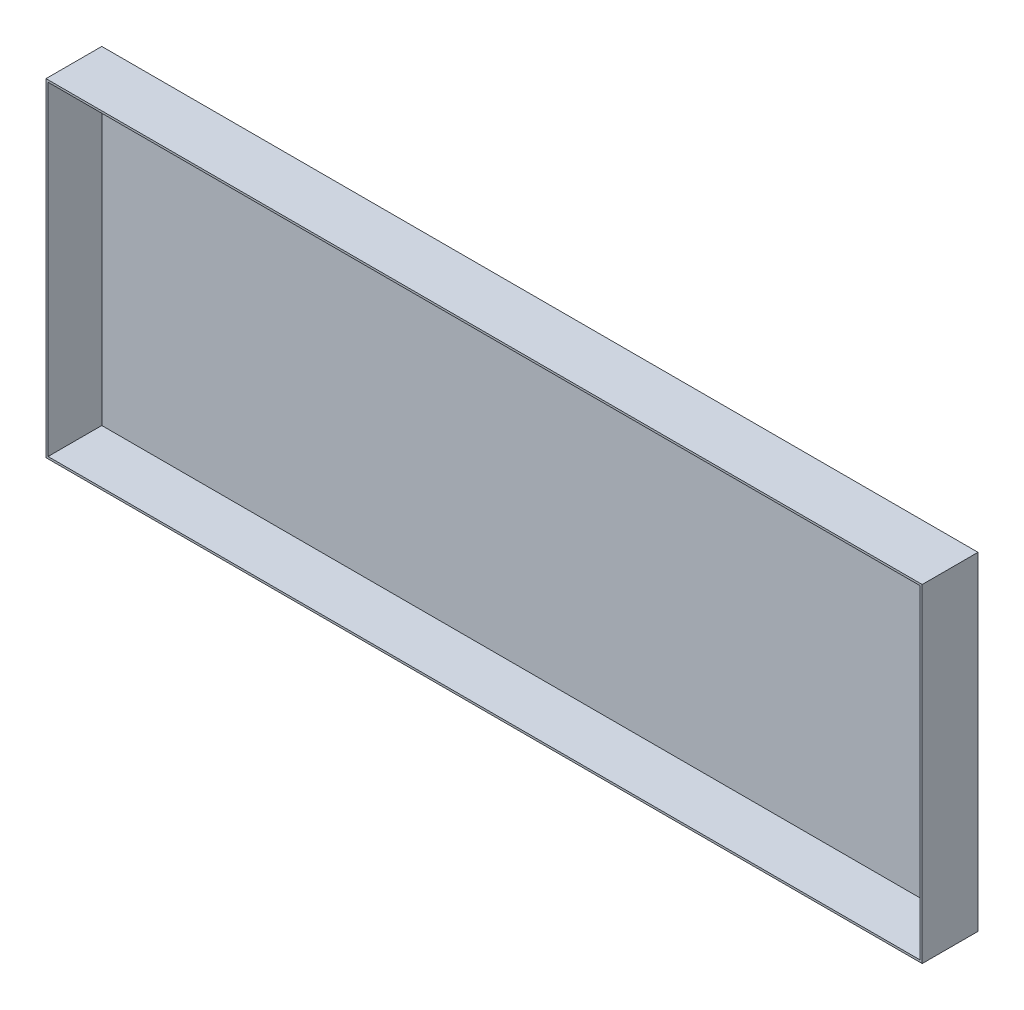
ISO-10303-21;
HEADER;
FILE_DESCRIPTION(('STEP AP214'),'2;1');
FILE_NAME('part.step','',(''),(''),'','','');
FILE_SCHEMA(('AUTOMOTIVE_DESIGN { 1 0 10303 214 1 1 1 1 }'));
ENDSEC;
DATA;
#1=APPLICATION_CONTEXT('core data for automotive mechanical design processes');
#2=APPLICATION_PROTOCOL_DEFINITION('international standard','automotive_design',2000,#1);
#3=PRODUCT_CONTEXT('',#1,'mechanical');
#4=PRODUCT('Part','Part','',(#3));
#5=PRODUCT_RELATED_PRODUCT_CATEGORY('part','',(#4));
#6=PRODUCT_DEFINITION_FORMATION('','',#4);
#7=PRODUCT_DEFINITION_CONTEXT('part definition',#1,'design');
#8=PRODUCT_DEFINITION('design','',#6,#7);
#9=PRODUCT_DEFINITION_SHAPE('','',#8);
#10=(LENGTH_UNIT() NAMED_UNIT(*) SI_UNIT(.MILLI.,.METRE.));
#11=(NAMED_UNIT(*) PLANE_ANGLE_UNIT() SI_UNIT($,.RADIAN.));
#12=(NAMED_UNIT(*) SI_UNIT($,.STERADIAN.) SOLID_ANGLE_UNIT());
#13=UNCERTAINTY_MEASURE_WITH_UNIT(LENGTH_MEASURE(1.E-05),#10,'distance_accuracy_value','');
#14=(GEOMETRIC_REPRESENTATION_CONTEXT(3) GLOBAL_UNCERTAINTY_ASSIGNED_CONTEXT((#13)) GLOBAL_UNIT_ASSIGNED_CONTEXT((#10,
#11,#12)) REPRESENTATION_CONTEXT('',''));
#15=CARTESIAN_POINT('',(0.,0.,0.));
#16=DIRECTION('',(0.,0.,1.));
#17=DIRECTION('',(1.,0.,0.));
#18=AXIS2_PLACEMENT_3D('',#15,#16,#17);
#19=CARTESIAN_POINT('',(399.,149.5,50.8));
#20=DIRECTION('',(-1.,0.,0.));
#21=DIRECTION('',(0.,0.,1.));
#22=AXIS2_PLACEMENT_3D('',#19,#20,#21);
#23=PLANE('',#22);
#24=DIRECTION('',(0.,1.,0.));
#25=VECTOR('',#24,1.);
#26=CARTESIAN_POINT('',(399.,149.5,0.));
#27=LINE('',#26,#25);
#28=CARTESIAN_POINT('',(399.,-149.5,0.));
#29=VERTEX_POINT('',#28);
#30=CARTESIAN_POINT('',(399.,149.5,0.));
#31=VERTEX_POINT('',#30);
#32=EDGE_CURVE('E146',#29,#31,#27,.T.);
#33=ORIENTED_EDGE('',*,*,#32,.T.);
#34=DIRECTION('',(0.,0.,-1.));
#35=VECTOR('',#34,1.);
#36=CARTESIAN_POINT('',(399.,149.5,50.8));
#37=LINE('',#36,#35);
#38=CARTESIAN_POINT('',(399.,149.5,50.8));
#39=VERTEX_POINT('',#38);
#40=EDGE_CURVE('E11',#39,#31,#37,.T.);
#41=ORIENTED_EDGE('',*,*,#40,.F.);
#42=DIRECTION('',(0.,1.,0.));
#43=VECTOR('',#42,1.);
#44=CARTESIAN_POINT('',(399.,149.5,50.8));
#45=LINE('',#44,#43);
#46=CARTESIAN_POINT('',(399.,-149.5,50.8));
#47=VERTEX_POINT('',#46);
#48=EDGE_CURVE('E139',#47,#39,#45,.T.);
#49=ORIENTED_EDGE('',*,*,#48,.F.);
#50=DIRECTION('',(0.,0.,-1.));
#51=VECTOR('',#50,1.);
#52=CARTESIAN_POINT('',(399.,-149.5,50.8));
#53=LINE('',#52,#51);
#54=EDGE_CURVE('E145',#47,#29,#53,.T.);
#55=ORIENTED_EDGE('',*,*,#54,.T.);
#56=EDGE_LOOP('',(#33,#41,#49,#55));
#57=FACE_BOUND('',#56,.T.);
#58=ADVANCED_FACE('F32',(#57),#23,.F.);
#59=CARTESIAN_POINT('',(-399.,149.5,50.8));
#60=DIRECTION('',(0.,-1.,0.));
#61=DIRECTION('',(0.,0.,-1.));
#62=AXIS2_PLACEMENT_3D('',#59,#60,#61);
#63=PLANE('',#62);
#64=DIRECTION('',(-1.,0.,0.));
#65=VECTOR('',#64,1.);
#66=CARTESIAN_POINT('',(-399.,149.5,0.));
#67=LINE('',#66,#65);
#68=CARTESIAN_POINT('',(-399.,149.5,0.));
#69=VERTEX_POINT('',#68);
#70=EDGE_CURVE('E149',#31,#69,#67,.T.);
#71=ORIENTED_EDGE('',*,*,#70,.T.);
#72=DIRECTION('',(0.,0.,-1.));
#73=VECTOR('',#72,1.);
#74=CARTESIAN_POINT('',(-399.,149.5,50.8));
#75=LINE('',#74,#73);
#76=CARTESIAN_POINT('',(-399.,149.5,50.8));
#77=VERTEX_POINT('',#76);
#78=EDGE_CURVE('E39',#77,#69,#75,.T.);
#79=ORIENTED_EDGE('',*,*,#78,.F.);
#80=DIRECTION('',(-1.,0.,0.));
#81=VECTOR('',#80,1.);
#82=CARTESIAN_POINT('',(-399.,149.5,50.8));
#83=LINE('',#82,#81);
#84=EDGE_CURVE('E83',#39,#77,#83,.T.);
#85=ORIENTED_EDGE('',*,*,#84,.F.);
#86=ORIENTED_EDGE('',*,*,#40,.T.);
#87=EDGE_LOOP('',(#71,#79,#85,#86));
#88=FACE_BOUND('',#87,.T.);
#89=ADVANCED_FACE('F178',(#88),#63,.F.);
#90=CARTESIAN_POINT('',(-399.,149.5,50.8));
#91=DIRECTION('',(1.,0.,0.));
#92=DIRECTION('',(0.,1.,0.));
#93=AXIS2_PLACEMENT_3D('',#90,#91,#92);
#94=PLANE('',#93);
#95=DIRECTION('',(0.,-1.,0.));
#96=VECTOR('',#95,1.);
#97=CARTESIAN_POINT('',(-399.,149.5,0.));
#98=LINE('',#97,#96);
#99=CARTESIAN_POINT('',(-399.,-149.5,0.));
#100=VERTEX_POINT('',#99);
#101=EDGE_CURVE('E151',#69,#100,#98,.T.);
#102=ORIENTED_EDGE('',*,*,#101,.T.);
#103=DIRECTION('',(0.,0.,-1.));
#104=VECTOR('',#103,1.);
#105=CARTESIAN_POINT('',(-399.,-149.5,50.8));
#106=LINE('',#105,#104);
#107=CARTESIAN_POINT('',(-399.,-149.5,50.8));
#108=VERTEX_POINT('',#107);
#109=EDGE_CURVE('E155',#108,#100,#106,.T.);
#110=ORIENTED_EDGE('',*,*,#109,.F.);
#111=DIRECTION('',(0.,-1.,0.));
#112=VECTOR('',#111,1.);
#113=CARTESIAN_POINT('',(-399.,149.5,50.8));
#114=LINE('',#113,#112);
#115=EDGE_CURVE('E142',#77,#108,#114,.T.);
#116=ORIENTED_EDGE('',*,*,#115,.F.);
#117=ORIENTED_EDGE('',*,*,#78,.T.);
#118=EDGE_LOOP('',(#102,#110,#116,#117));
#119=FACE_BOUND('',#118,.T.);
#120=ADVANCED_FACE('F160',(#119),#94,.F.);
#121=CARTESIAN_POINT('',(-399.,-149.5,50.8));
#122=DIRECTION('',(0.,1.,0.));
#123=DIRECTION('',(0.,0.,1.));
#124=AXIS2_PLACEMENT_3D('',#121,#122,#123);
#125=PLANE('',#124);
#126=DIRECTION('',(1.,0.,0.));
#127=VECTOR('',#126,1.);
#128=CARTESIAN_POINT('',(-399.,-149.5,0.));
#129=LINE('',#128,#127);
#130=EDGE_CURVE('E76',#100,#29,#129,.T.);
#131=ORIENTED_EDGE('',*,*,#130,.T.);
#132=ORIENTED_EDGE('',*,*,#54,.F.);
#133=DIRECTION('',(1.,0.,0.));
#134=VECTOR('',#133,1.);
#135=CARTESIAN_POINT('',(-399.,-149.5,50.8));
#136=LINE('',#135,#134);
#137=EDGE_CURVE('E55',#108,#47,#136,.T.);
#138=ORIENTED_EDGE('',*,*,#137,.F.);
#139=ORIENTED_EDGE('',*,*,#109,.T.);
#140=EDGE_LOOP('',(#131,#132,#138,#139));
#141=FACE_BOUND('',#140,.T.);
#142=ADVANCED_FACE('F168',(#141),#125,.F.);
#143=CARTESIAN_POINT('',(0.,0.,50.8));
#144=DIRECTION('',(0.,0.,1.));
#145=DIRECTION('',(1.,0.,0.));
#146=AXIS2_PLACEMENT_3D('',#143,#144,#145);
#147=PLANE('',#146);
#148=DIRECTION('',(0.,1.,0.));
#149=VECTOR('',#148,1.);
#150=CARTESIAN_POINT('',(397.1,149.5,50.8));
#151=LINE('',#150,#149);
#152=CARTESIAN_POINT('',(397.1,-147.6,50.8));
#153=VERTEX_POINT('',#152);
#154=CARTESIAN_POINT('',(397.1,147.6,50.8));
#155=VERTEX_POINT('',#154);
#156=EDGE_CURVE('E128',#153,#155,#151,.T.);
#157=ORIENTED_EDGE('',*,*,#156,.F.);
#158=DIRECTION('',(1.,0.,0.));
#159=VECTOR('',#158,1.);
#160=CARTESIAN_POINT('',(-399.,-147.6,50.8));
#161=LINE('',#160,#159);
#162=CARTESIAN_POINT('',(-397.1,-147.6,50.8));
#163=VERTEX_POINT('',#162);
#164=EDGE_CURVE('E137',#163,#153,#161,.T.);
#165=ORIENTED_EDGE('',*,*,#164,.F.);
#166=DIRECTION('',(0.,-1.,0.));
#167=VECTOR('',#166,1.);
#168=CARTESIAN_POINT('',(-397.1,149.5,50.8));
#169=LINE('',#168,#167);
#170=CARTESIAN_POINT('',(-397.1,147.6,50.8));
#171=VERTEX_POINT('',#170);
#172=EDGE_CURVE('E135',#171,#163,#169,.T.);
#173=ORIENTED_EDGE('',*,*,#172,.F.);
#174=DIRECTION('',(-1.,0.,0.));
#175=VECTOR('',#174,1.);
#176=CARTESIAN_POINT('',(-399.,147.6,50.8));
#177=LINE('',#176,#175);
#178=EDGE_CURVE('E120',#155,#171,#177,.T.);
#179=ORIENTED_EDGE('',*,*,#178,.F.);
#180=EDGE_LOOP('',(#157,#165,#173,#179));
#181=FACE_BOUND('',#180,.T.);
#182=ORIENTED_EDGE('',*,*,#48,.T.);
#183=ORIENTED_EDGE('',*,*,#84,.T.);
#184=ORIENTED_EDGE('',*,*,#115,.T.);
#185=ORIENTED_EDGE('',*,*,#137,.T.);
#186=EDGE_LOOP('',(#182,#183,#184,#185));
#187=FACE_BOUND('',#186,.T.);
#188=ADVANCED_FACE('F170',(#181,#187),#147,.T.);
#189=CARTESIAN_POINT('',(0.,0.,0.));
#190=DIRECTION('',(0.,0.,1.));
#191=DIRECTION('',(1.,0.,0.));
#192=AXIS2_PLACEMENT_3D('',#189,#190,#191);
#193=PLANE('',#192);
#194=ORIENTED_EDGE('',*,*,#32,.F.);
#195=ORIENTED_EDGE('',*,*,#130,.F.);
#196=ORIENTED_EDGE('',*,*,#101,.F.);
#197=ORIENTED_EDGE('',*,*,#70,.F.);
#198=EDGE_LOOP('',(#194,#195,#196,#197));
#199=FACE_BOUND('',#198,.T.);
#200=ADVANCED_FACE('F164',(#199),#193,.F.);
#201=CARTESIAN_POINT('',(397.1,149.5,50.8));
#202=DIRECTION('',(-1.,0.,0.));
#203=DIRECTION('',(0.,0.,1.));
#204=AXIS2_PLACEMENT_3D('',#201,#202,#203);
#205=PLANE('',#204);
#206=DIRECTION('',(0.,1.,0.));
#207=VECTOR('',#206,1.);
#208=CARTESIAN_POINT('',(397.1,149.5,1.9));
#209=LINE('',#208,#207);
#210=CARTESIAN_POINT('',(397.1,-147.6,1.9));
#211=VERTEX_POINT('',#210);
#212=CARTESIAN_POINT('',(397.1,147.6,1.9));
#213=VERTEX_POINT('',#212);
#214=EDGE_CURVE('E111',#211,#213,#209,.T.);
#215=ORIENTED_EDGE('',*,*,#214,.F.);
#216=DIRECTION('',(0.,0.,-1.));
#217=VECTOR('',#216,1.);
#218=CARTESIAN_POINT('',(397.1,-147.6,50.8));
#219=LINE('',#218,#217);
#220=EDGE_CURVE('E131',#153,#211,#219,.T.);
#221=ORIENTED_EDGE('',*,*,#220,.F.);
#222=ORIENTED_EDGE('',*,*,#156,.T.);
#223=DIRECTION('',(0.,0.,-1.));
#224=VECTOR('',#223,1.);
#225=CARTESIAN_POINT('',(397.1,147.6,50.8));
#226=LINE('',#225,#224);
#227=EDGE_CURVE('E123',#155,#213,#226,.T.);
#228=ORIENTED_EDGE('',*,*,#227,.T.);
#229=EDGE_LOOP('',(#215,#221,#222,#228));
#230=FACE_BOUND('',#229,.T.);
#231=ADVANCED_FACE('F205',(#230),#205,.T.);
#232=CARTESIAN_POINT('',(-399.,147.6,50.8));
#233=DIRECTION('',(0.,-1.,0.));
#234=DIRECTION('',(0.,0.,-1.));
#235=AXIS2_PLACEMENT_3D('',#232,#233,#234);
#236=PLANE('',#235);
#237=DIRECTION('',(-1.,0.,0.));
#238=VECTOR('',#237,1.);
#239=CARTESIAN_POINT('',(-399.,147.6,1.9));
#240=LINE('',#239,#238);
#241=CARTESIAN_POINT('',(-397.1,147.6,1.9));
#242=VERTEX_POINT('',#241);
#243=EDGE_CURVE('E105',#213,#242,#240,.T.);
#244=ORIENTED_EDGE('',*,*,#243,.F.);
#245=ORIENTED_EDGE('',*,*,#227,.F.);
#246=ORIENTED_EDGE('',*,*,#178,.T.);
#247=DIRECTION('',(0.,0.,-1.));
#248=VECTOR('',#247,1.);
#249=CARTESIAN_POINT('',(-397.1,147.6,50.8));
#250=LINE('',#249,#248);
#251=EDGE_CURVE('E117',#171,#242,#250,.T.);
#252=ORIENTED_EDGE('',*,*,#251,.T.);
#253=EDGE_LOOP('',(#244,#245,#246,#252));
#254=FACE_BOUND('',#253,.T.);
#255=ADVANCED_FACE('F118',(#254),#236,.T.);
#256=CARTESIAN_POINT('',(-397.1,149.5,50.8));
#257=DIRECTION('',(1.,0.,0.));
#258=DIRECTION('',(0.,1.,0.));
#259=AXIS2_PLACEMENT_3D('',#256,#257,#258);
#260=PLANE('',#259);
#261=DIRECTION('',(0.,-1.,0.));
#262=VECTOR('',#261,1.);
#263=CARTESIAN_POINT('',(-397.1,149.5,1.9));
#264=LINE('',#263,#262);
#265=CARTESIAN_POINT('',(-397.1,-147.6,1.9));
#266=VERTEX_POINT('',#265);
#267=EDGE_CURVE('E109',#242,#266,#264,.T.);
#268=ORIENTED_EDGE('',*,*,#267,.F.);
#269=ORIENTED_EDGE('',*,*,#251,.F.);
#270=ORIENTED_EDGE('',*,*,#172,.T.);
#271=DIRECTION('',(0.,0.,-1.));
#272=VECTOR('',#271,1.);
#273=CARTESIAN_POINT('',(-397.1,-147.6,50.8));
#274=LINE('',#273,#272);
#275=EDGE_CURVE('E46',#163,#266,#274,.T.);
#276=ORIENTED_EDGE('',*,*,#275,.T.);
#277=EDGE_LOOP('',(#268,#269,#270,#276));
#278=FACE_BOUND('',#277,.T.);
#279=ADVANCED_FACE('F125',(#278),#260,.T.);
#280=CARTESIAN_POINT('',(-399.,-147.6,50.8));
#281=DIRECTION('',(0.,1.,0.));
#282=DIRECTION('',(0.,0.,1.));
#283=AXIS2_PLACEMENT_3D('',#280,#281,#282);
#284=PLANE('',#283);
#285=DIRECTION('',(1.,0.,0.));
#286=VECTOR('',#285,1.);
#287=CARTESIAN_POINT('',(-399.,-147.6,1.9));
#288=LINE('',#287,#286);
#289=EDGE_CURVE('E126',#266,#211,#288,.T.);
#290=ORIENTED_EDGE('',*,*,#289,.F.);
#291=ORIENTED_EDGE('',*,*,#275,.F.);
#292=ORIENTED_EDGE('',*,*,#164,.T.);
#293=ORIENTED_EDGE('',*,*,#220,.T.);
#294=EDGE_LOOP('',(#290,#291,#292,#293));
#295=FACE_BOUND('',#294,.T.);
#296=ADVANCED_FACE('F235',(#295),#284,.T.);
#297=CARTESIAN_POINT('',(0.,0.,1.9));
#298=DIRECTION('',(0.,0.,1.));
#299=DIRECTION('',(1.,0.,0.));
#300=AXIS2_PLACEMENT_3D('',#297,#298,#299);
#301=PLANE('',#300);
#302=ORIENTED_EDGE('',*,*,#214,.T.);
#303=ORIENTED_EDGE('',*,*,#243,.T.);
#304=ORIENTED_EDGE('',*,*,#267,.T.);
#305=ORIENTED_EDGE('',*,*,#289,.T.);
#306=EDGE_LOOP('',(#302,#303,#304,#305));
#307=FACE_BOUND('',#306,.T.);
#308=ADVANCED_FACE('F107',(#307),#301,.T.);
#309=CLOSED_SHELL('',(#58,#89,#120,#142,#188,#200,#231,#255,#279,#296,#308));
#310=MANIFOLD_SOLID_BREP('B2',#309);
#311=ADVANCED_BREP_SHAPE_REPRESENTATION('',(#18,#310),#14);
#312=SHAPE_DEFINITION_REPRESENTATION(#9,#311);
ENDSEC;
END-ISO-10303-21;
